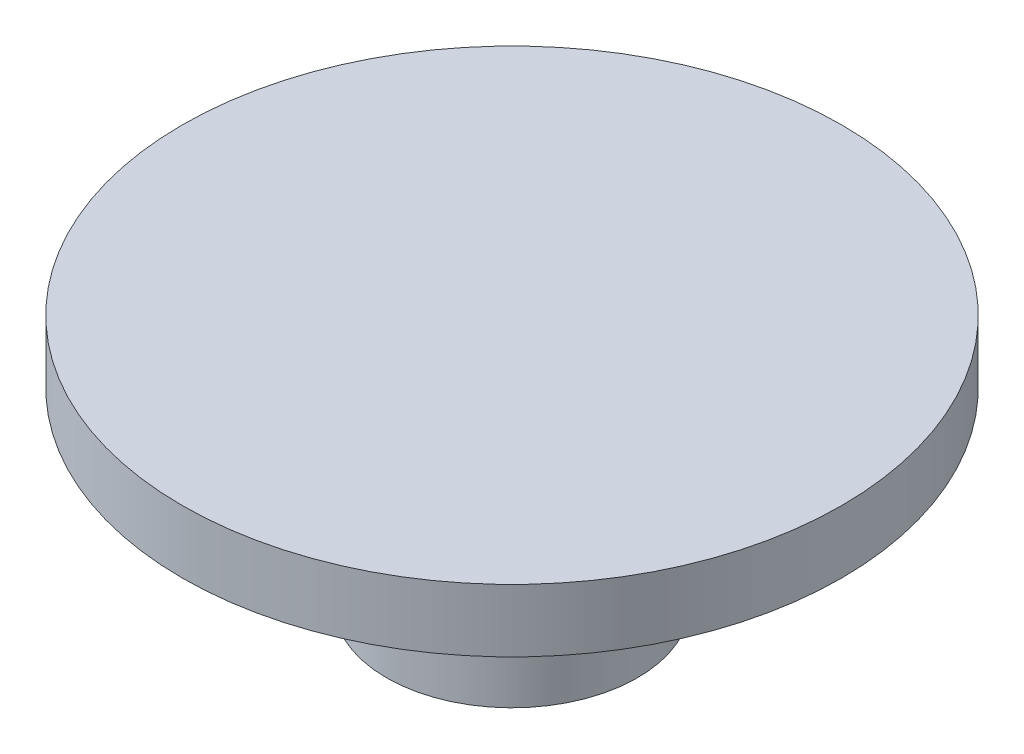
ISO-10303-21;
HEADER;
FILE_DESCRIPTION(('STEP AP214'),'2;1');
FILE_NAME('part.step','',(''),(''),'','','');
FILE_SCHEMA(('AUTOMOTIVE_DESIGN { 1 0 10303 214 1 1 1 1 }'));
ENDSEC;
DATA;
#1=APPLICATION_CONTEXT('core data for automotive mechanical design processes');
#2=APPLICATION_PROTOCOL_DEFINITION('international standard','automotive_design',2000,#1);
#3=PRODUCT_CONTEXT('',#1,'mechanical');
#4=PRODUCT('Part','Part','',(#3));
#5=PRODUCT_RELATED_PRODUCT_CATEGORY('part','',(#4));
#6=PRODUCT_DEFINITION_FORMATION('','',#4);
#7=PRODUCT_DEFINITION_CONTEXT('part definition',#1,'design');
#8=PRODUCT_DEFINITION('design','',#6,#7);
#9=PRODUCT_DEFINITION_SHAPE('','',#8);
#10=(LENGTH_UNIT() NAMED_UNIT(*) SI_UNIT(.MILLI.,.METRE.));
#11=(NAMED_UNIT(*) PLANE_ANGLE_UNIT() SI_UNIT($,.RADIAN.));
#12=(NAMED_UNIT(*) SI_UNIT($,.STERADIAN.) SOLID_ANGLE_UNIT());
#13=UNCERTAINTY_MEASURE_WITH_UNIT(LENGTH_MEASURE(1.E-05),#10,'distance_accuracy_value','');
#14=(GEOMETRIC_REPRESENTATION_CONTEXT(3) GLOBAL_UNCERTAINTY_ASSIGNED_CONTEXT((#13)) GLOBAL_UNIT_ASSIGNED_CONTEXT((#10,
#11,#12)) REPRESENTATION_CONTEXT('',''));
#15=CARTESIAN_POINT('',(0.,0.,0.));
#16=DIRECTION('',(0.,0.,1.));
#17=DIRECTION('',(1.,0.,0.));
#18=AXIS2_PLACEMENT_3D('',#15,#16,#17);
#19=CARTESIAN_POINT('',(0.,6.,0.));
#20=DIRECTION('',(0.,-1.,0.));
#21=DIRECTION('',(0.,0.,-1.));
#22=AXIS2_PLACEMENT_3D('',#19,#20,#21);
#23=CYLINDRICAL_SURFACE('',#22,4.);
#24=CARTESIAN_POINT('',(0.,6.,0.));
#25=DIRECTION('',(0.,1.,0.));
#26=DIRECTION('',(0.,0.,1.));
#27=AXIS2_PLACEMENT_3D('',#24,#25,#26);
#28=CIRCLE('',#27,4.);
#29=CARTESIAN_POINT('',(0.,6.,4.));
#30=VERTEX_POINT('',#29);
#31=EDGE_CURVE('E10',#30,#30,#28,.T.);
#32=ORIENTED_EDGE('',*,*,#31,.F.);
#33=EDGE_LOOP('',(#32));
#34=FACE_BOUND('',#33,.T.);
#35=CARTESIAN_POINT('',(0.,0.,0.));
#36=DIRECTION('',(0.,1.,0.));
#37=DIRECTION('',(0.,0.,1.));
#38=AXIS2_PLACEMENT_3D('',#35,#36,#37);
#39=CIRCLE('',#38,4.);
#40=CARTESIAN_POINT('',(0.,0.,4.));
#41=VERTEX_POINT('',#40);
#42=EDGE_CURVE('E33',#41,#41,#39,.T.);
#43=ORIENTED_EDGE('',*,*,#42,.T.);
#44=EDGE_LOOP('',(#43));
#45=FACE_BOUND('',#44,.T.);
#46=ADVANCED_FACE('F30',(#34,#45),#23,.T.);
#47=CARTESIAN_POINT('',(0.,0.,0.));
#48=DIRECTION('',(0.,1.,0.));
#49=DIRECTION('',(0.,0.,1.));
#50=AXIS2_PLACEMENT_3D('',#47,#48,#49);
#51=PLANE('',#50);
#52=ORIENTED_EDGE('',*,*,#42,.F.);
#53=EDGE_LOOP('',(#52));
#54=FACE_BOUND('',#53,.T.);
#55=ADVANCED_FACE('F58',(#54),#51,.F.);
#56=CARTESIAN_POINT('',(0.,6.,0.));
#57=DIRECTION('',(0.,1.,0.));
#58=DIRECTION('',(0.,0.,1.));
#59=AXIS2_PLACEMENT_3D('',#56,#57,#58);
#60=PLANE('',#59);
#61=CARTESIAN_POINT('',(0.,6.,0.));
#62=DIRECTION('',(0.,1.,0.));
#63=DIRECTION('',(0.,0.,1.));
#64=AXIS2_PLACEMENT_3D('',#61,#62,#63);
#65=CIRCLE('',#64,10.5);
#66=CARTESIAN_POINT('',(0.,6.,10.5));
#67=VERTEX_POINT('',#66);
#68=EDGE_CURVE('E42',#67,#67,#65,.T.);
#69=ORIENTED_EDGE('',*,*,#68,.F.);
#70=EDGE_LOOP('',(#69));
#71=FACE_BOUND('',#70,.T.);
#72=ORIENTED_EDGE('',*,*,#31,.T.);
#73=EDGE_LOOP('',(#72));
#74=FACE_BOUND('',#73,.T.);
#75=ADVANCED_FACE('F53',(#71,#74),#60,.F.);
#76=CARTESIAN_POINT('',(0.,8.,0.));
#77=DIRECTION('',(0.,-1.,0.));
#78=DIRECTION('',(0.,0.,-1.));
#79=AXIS2_PLACEMENT_3D('',#76,#77,#78);
#80=CYLINDRICAL_SURFACE('',#79,10.5);
#81=CARTESIAN_POINT('',(0.,8.,0.));
#82=DIRECTION('',(0.,1.,0.));
#83=DIRECTION('',(0.,0.,1.));
#84=AXIS2_PLACEMENT_3D('',#81,#82,#83);
#85=CIRCLE('',#84,10.5);
#86=CARTESIAN_POINT('',(0.,8.,10.5));
#87=VERTEX_POINT('',#86);
#88=EDGE_CURVE('E40',#87,#87,#85,.T.);
#89=ORIENTED_EDGE('',*,*,#88,.F.);
#90=EDGE_LOOP('',(#89));
#91=FACE_BOUND('',#90,.T.);
#92=ORIENTED_EDGE('',*,*,#68,.T.);
#93=EDGE_LOOP('',(#92));
#94=FACE_BOUND('',#93,.T.);
#95=ADVANCED_FACE('F50',(#91,#94),#80,.T.);
#96=CARTESIAN_POINT('',(0.,8.,0.));
#97=DIRECTION('',(0.,1.,0.));
#98=DIRECTION('',(0.,0.,1.));
#99=AXIS2_PLACEMENT_3D('',#96,#97,#98);
#100=PLANE('',#99);
#101=ORIENTED_EDGE('',*,*,#88,.T.);
#102=EDGE_LOOP('',(#101));
#103=FACE_BOUND('',#102,.T.);
#104=ADVANCED_FACE('F48',(#103),#100,.T.);
#105=CLOSED_SHELL('',(#46,#55,#75,#95,#104));
#106=MANIFOLD_SOLID_BREP('B2',#105);
#107=ADVANCED_BREP_SHAPE_REPRESENTATION('',(#18,#106),#14);
#108=SHAPE_DEFINITION_REPRESENTATION(#9,#107);
ENDSEC;
END-ISO-10303-21;
